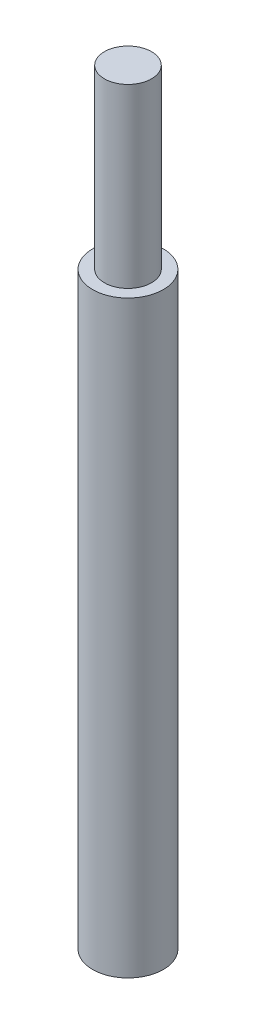
ISO-10303-21;
HEADER;
FILE_DESCRIPTION(('STEP AP214'),'2;1');
FILE_NAME('part.step','',(''),(''),'','','');
FILE_SCHEMA(('AUTOMOTIVE_DESIGN { 1 0 10303 214 1 1 1 1 }'));
ENDSEC;
DATA;
#1=APPLICATION_CONTEXT('core data for automotive mechanical design processes');
#2=APPLICATION_PROTOCOL_DEFINITION('international standard','automotive_design',2000,#1);
#3=PRODUCT_CONTEXT('',#1,'mechanical');
#4=PRODUCT('Part','Part','',(#3));
#5=PRODUCT_RELATED_PRODUCT_CATEGORY('part','',(#4));
#6=PRODUCT_DEFINITION_FORMATION('','',#4);
#7=PRODUCT_DEFINITION_CONTEXT('part definition',#1,'design');
#8=PRODUCT_DEFINITION('design','',#6,#7);
#9=PRODUCT_DEFINITION_SHAPE('','',#8);
#10=(LENGTH_UNIT() NAMED_UNIT(*) SI_UNIT(.MILLI.,.METRE.));
#11=(NAMED_UNIT(*) PLANE_ANGLE_UNIT() SI_UNIT($,.RADIAN.));
#12=(NAMED_UNIT(*) SI_UNIT($,.STERADIAN.) SOLID_ANGLE_UNIT());
#13=UNCERTAINTY_MEASURE_WITH_UNIT(LENGTH_MEASURE(1.E-05),#10,'distance_accuracy_value','');
#14=(GEOMETRIC_REPRESENTATION_CONTEXT(3) GLOBAL_UNCERTAINTY_ASSIGNED_CONTEXT((#13)) GLOBAL_UNIT_ASSIGNED_CONTEXT((#10,
#11,#12)) REPRESENTATION_CONTEXT('',''));
#15=CARTESIAN_POINT('',(0.,0.,0.));
#16=DIRECTION('',(0.,0.,1.));
#17=DIRECTION('',(1.,0.,0.));
#18=AXIS2_PLACEMENT_3D('',#15,#16,#17);
#19=CARTESIAN_POINT('',(0.,50.,0.));
#20=DIRECTION('',(0.,-1.,0.));
#21=DIRECTION('',(0.,0.,-1.));
#22=AXIS2_PLACEMENT_3D('',#19,#20,#21);
#23=CYLINDRICAL_SURFACE('',#22,3.);
#24=CARTESIAN_POINT('',(0.,50.,0.));
#25=DIRECTION('',(0.,1.,0.));
#26=DIRECTION('',(0.,0.,1.));
#27=AXIS2_PLACEMENT_3D('',#24,#25,#26);
#28=CIRCLE('',#27,3.);
#29=CARTESIAN_POINT('',(0.,50.,3.));
#30=VERTEX_POINT('',#29);
#31=EDGE_CURVE('E55',#30,#30,#28,.T.);
#32=ORIENTED_EDGE('',*,*,#31,.F.);
#33=EDGE_LOOP('',(#32));
#34=FACE_BOUND('',#33,.T.);
#35=CARTESIAN_POINT('',(0.,0.,0.));
#36=DIRECTION('',(0.,1.,0.));
#37=DIRECTION('',(0.,0.,1.));
#38=AXIS2_PLACEMENT_3D('',#35,#36,#37);
#39=CIRCLE('',#38,3.);
#40=CARTESIAN_POINT('',(0.,0.,3.));
#41=VERTEX_POINT('',#40);
#42=EDGE_CURVE('E48',#41,#41,#39,.T.);
#43=ORIENTED_EDGE('',*,*,#42,.T.);
#44=EDGE_LOOP('',(#43));
#45=FACE_BOUND('',#44,.T.);
#46=ADVANCED_FACE('F44',(#34,#45),#23,.T.);
#47=CARTESIAN_POINT('',(0.,50.,0.));
#48=DIRECTION('',(0.,1.,0.));
#49=DIRECTION('',(0.,0.,1.));
#50=AXIS2_PLACEMENT_3D('',#47,#48,#49);
#51=PLANE('',#50);
#52=CARTESIAN_POINT('',(0.,50.,0.));
#53=DIRECTION('',(0.,1.,0.));
#54=DIRECTION('',(0.,0.,1.));
#55=AXIS2_PLACEMENT_3D('',#52,#53,#54);
#56=CIRCLE('',#55,2.);
#57=CARTESIAN_POINT('',(0.,50.,2.));
#58=VERTEX_POINT('',#57);
#59=EDGE_CURVE('E10',#58,#58,#56,.T.);
#60=ORIENTED_EDGE('',*,*,#59,.F.);
#61=EDGE_LOOP('',(#60));
#62=FACE_BOUND('',#61,.T.);
#63=ORIENTED_EDGE('',*,*,#31,.T.);
#64=EDGE_LOOP('',(#63));
#65=FACE_BOUND('',#64,.T.);
#66=ADVANCED_FACE('F66',(#62,#65),#51,.T.);
#67=CARTESIAN_POINT('',(0.,0.,0.));
#68=DIRECTION('',(0.,1.,0.));
#69=DIRECTION('',(0.,0.,1.));
#70=AXIS2_PLACEMENT_3D('',#67,#68,#69);
#71=PLANE('',#70);
#72=ORIENTED_EDGE('',*,*,#42,.F.);
#73=EDGE_LOOP('',(#72));
#74=FACE_BOUND('',#73,.T.);
#75=ADVANCED_FACE('F67',(#74),#71,.F.);
#76=CARTESIAN_POINT('',(0.,65.,0.));
#77=DIRECTION('',(0.,-1.,0.));
#78=DIRECTION('',(0.,0.,-1.));
#79=AXIS2_PLACEMENT_3D('',#76,#77,#78);
#80=CYLINDRICAL_SURFACE('',#79,2.);
#81=CARTESIAN_POINT('',(0.,65.,0.));
#82=DIRECTION('',(0.,1.,0.));
#83=DIRECTION('',(0.,0.,1.));
#84=AXIS2_PLACEMENT_3D('',#81,#82,#83);
#85=CIRCLE('',#84,2.);
#86=CARTESIAN_POINT('',(0.,65.,2.));
#87=VERTEX_POINT('',#86);
#88=EDGE_CURVE('E59',#87,#87,#85,.T.);
#89=ORIENTED_EDGE('',*,*,#88,.F.);
#90=EDGE_LOOP('',(#89));
#91=FACE_BOUND('',#90,.T.);
#92=ORIENTED_EDGE('',*,*,#59,.T.);
#93=EDGE_LOOP('',(#92));
#94=FACE_BOUND('',#93,.T.);
#95=ADVANCED_FACE('F69',(#91,#94),#80,.T.);
#96=CARTESIAN_POINT('',(0.,65.,0.));
#97=DIRECTION('',(0.,1.,0.));
#98=DIRECTION('',(0.,0.,1.));
#99=AXIS2_PLACEMENT_3D('',#96,#97,#98);
#100=PLANE('',#99);
#101=ORIENTED_EDGE('',*,*,#88,.T.);
#102=EDGE_LOOP('',(#101));
#103=FACE_BOUND('',#102,.T.);
#104=ADVANCED_FACE('F73',(#103),#100,.T.);
#105=CLOSED_SHELL('',(#46,#66,#75,#95,#104));
#106=MANIFOLD_SOLID_BREP('B2',#105);
#107=ADVANCED_BREP_SHAPE_REPRESENTATION('',(#18,#106),#14);
#108=SHAPE_DEFINITION_REPRESENTATION(#9,#107);
ENDSEC;
END-ISO-10303-21;
